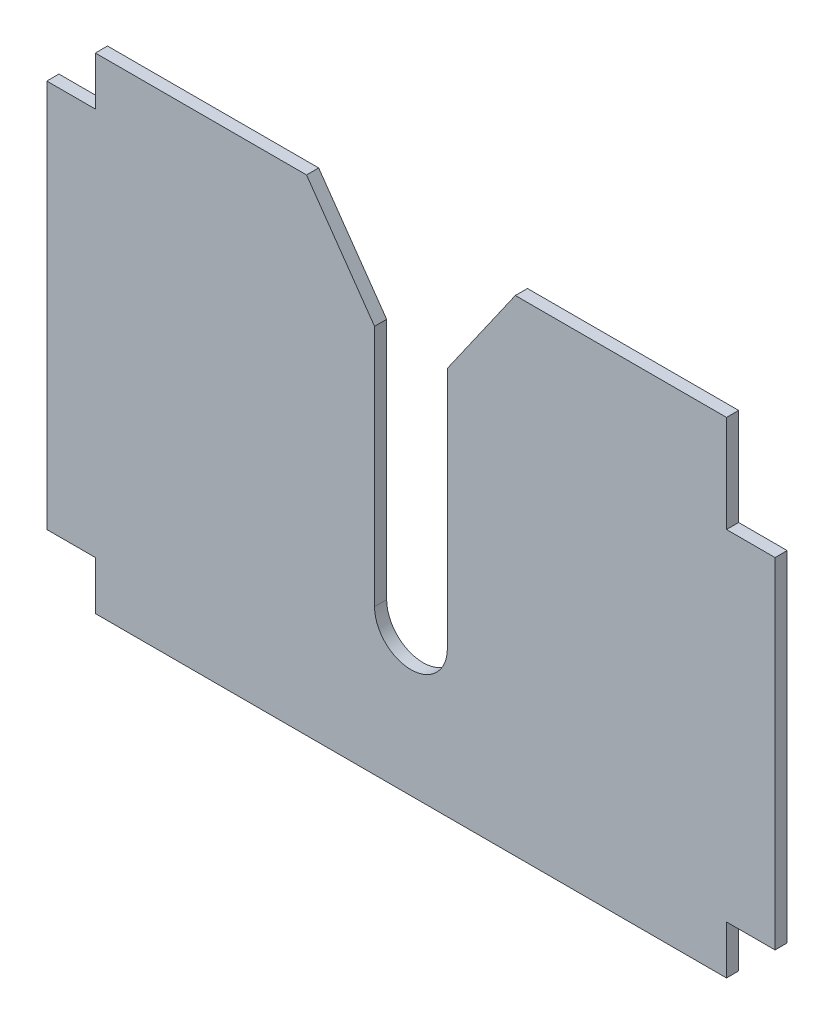
ISO-10303-21;
HEADER;
FILE_DESCRIPTION(('STEP AP214'),'2;1');
FILE_NAME('part.step','',(''),(''),'','','');
FILE_SCHEMA(('AUTOMOTIVE_DESIGN { 1 0 10303 214 1 1 1 1 }'));
ENDSEC;
DATA;
#1=APPLICATION_CONTEXT('core data for automotive mechanical design processes');
#2=APPLICATION_PROTOCOL_DEFINITION('international standard','automotive_design',2000,#1);
#3=PRODUCT_CONTEXT('',#1,'mechanical');
#4=PRODUCT('Part','Part','',(#3));
#5=PRODUCT_RELATED_PRODUCT_CATEGORY('part','',(#4));
#6=PRODUCT_DEFINITION_FORMATION('','',#4);
#7=PRODUCT_DEFINITION_CONTEXT('part definition',#1,'design');
#8=PRODUCT_DEFINITION('design','',#6,#7);
#9=PRODUCT_DEFINITION_SHAPE('','',#8);
#10=(LENGTH_UNIT() NAMED_UNIT(*) SI_UNIT(.MILLI.,.METRE.));
#11=(NAMED_UNIT(*) PLANE_ANGLE_UNIT() SI_UNIT($,.RADIAN.));
#12=(NAMED_UNIT(*) SI_UNIT($,.STERADIAN.) SOLID_ANGLE_UNIT());
#13=UNCERTAINTY_MEASURE_WITH_UNIT(LENGTH_MEASURE(1.E-05),#10,'distance_accuracy_value','');
#14=(GEOMETRIC_REPRESENTATION_CONTEXT(3) GLOBAL_UNCERTAINTY_ASSIGNED_CONTEXT((#13)) GLOBAL_UNIT_ASSIGNED_CONTEXT((#10,
#11,#12)) REPRESENTATION_CONTEXT('',''));
#15=CARTESIAN_POINT('',(0.,0.,0.));
#16=DIRECTION('',(0.,0.,1.));
#17=DIRECTION('',(1.,0.,0.));
#18=AXIS2_PLACEMENT_3D('',#15,#16,#17);
#19=CARTESIAN_POINT('',(-150.,100.,5.));
#20=DIRECTION('',(0.,-1.,0.));
#21=DIRECTION('',(0.,0.,-1.));
#22=AXIS2_PLACEMENT_3D('',#19,#20,#21);
#23=PLANE('',#22);
#24=DIRECTION('',(-1.,0.,0.));
#25=VECTOR('',#24,1.);
#26=CARTESIAN_POINT('',(-150.,100.,5.));
#27=LINE('',#26,#25);
#28=CARTESIAN_POINT('',(-43.0083015283883,100.,5.));
#29=VERTEX_POINT('',#28);
#30=CARTESIAN_POINT('',(-130.,100.,5.));
#31=VERTEX_POINT('',#30);
#32=EDGE_CURVE('E275',#29,#31,#27,.T.);
#33=ORIENTED_EDGE('',*,*,#32,.F.);
#34=DIRECTION('',(0.,0.,1.));
#35=VECTOR('',#34,1.);
#36=CARTESIAN_POINT('',(-43.0083015283883,100.,-5.));
#37=LINE('',#36,#35);
#38=CARTESIAN_POINT('',(-43.0083015283883,100.,0.));
#39=VERTEX_POINT('',#38);
#40=EDGE_CURVE('E210',#39,#29,#37,.T.);
#41=ORIENTED_EDGE('',*,*,#40,.F.);
#42=DIRECTION('',(-1.,0.,0.));
#43=VECTOR('',#42,1.);
#44=CARTESIAN_POINT('',(-150.,100.,0.));
#45=LINE('',#44,#43);
#46=CARTESIAN_POINT('',(-130.,100.,0.));
#47=VERTEX_POINT('',#46);
#48=EDGE_CURVE('E286',#39,#47,#45,.T.);
#49=ORIENTED_EDGE('',*,*,#48,.T.);
#50=DIRECTION('',(0.,0.,1.));
#51=VECTOR('',#50,1.);
#52=CARTESIAN_POINT('',(-130.,100.,0.));
#53=LINE('',#52,#51);
#54=EDGE_CURVE('E217',#47,#31,#53,.T.);
#55=ORIENTED_EDGE('',*,*,#54,.T.);
#56=EDGE_LOOP('',(#33,#41,#49,#55));
#57=FACE_BOUND('',#56,.T.);
#58=ADVANCED_FACE('F37',(#57),#23,.F.);
#59=CARTESIAN_POINT('',(150.,100.,5.));
#60=DIRECTION('',(-1.,0.,0.));
#61=DIRECTION('',(0.,-1.,0.));
#62=AXIS2_PLACEMENT_3D('',#59,#60,#61);
#63=PLANE('',#62);
#64=DIRECTION('',(0.,1.,0.));
#65=VECTOR('',#64,1.);
#66=CARTESIAN_POINT('',(150.,100.,5.));
#67=LINE('',#66,#65);
#68=CARTESIAN_POINT('',(150.,-80.,5.));
#69=VERTEX_POINT('',#68);
#70=CARTESIAN_POINT('',(150.,60.,5.));
#71=VERTEX_POINT('',#70);
#72=EDGE_CURVE('E272',#69,#71,#67,.T.);
#73=ORIENTED_EDGE('',*,*,#72,.F.);
#74=DIRECTION('',(0.,0.,1.));
#75=VECTOR('',#74,1.);
#76=CARTESIAN_POINT('',(150.,-80.,0.));
#77=LINE('',#76,#75);
#78=CARTESIAN_POINT('',(150.,-80.,0.));
#79=VERTEX_POINT('',#78);
#80=EDGE_CURVE('E249',#79,#69,#77,.T.);
#81=ORIENTED_EDGE('',*,*,#80,.F.);
#82=DIRECTION('',(0.,1.,0.));
#83=VECTOR('',#82,1.);
#84=CARTESIAN_POINT('',(150.,100.,0.));
#85=LINE('',#84,#83);
#86=CARTESIAN_POINT('',(150.,60.,0.));
#87=VERTEX_POINT('',#86);
#88=EDGE_CURVE('E268',#79,#87,#85,.T.);
#89=ORIENTED_EDGE('',*,*,#88,.T.);
#90=DIRECTION('',(0.,0.,1.));
#91=VECTOR('',#90,1.);
#92=CARTESIAN_POINT('',(150.,60.,0.));
#93=LINE('',#92,#91);
#94=EDGE_CURVE('E220',#87,#71,#93,.T.);
#95=ORIENTED_EDGE('',*,*,#94,.T.);
#96=EDGE_LOOP('',(#73,#81,#89,#95));
#97=FACE_BOUND('',#96,.T.);
#98=ADVANCED_FACE('F39',(#97),#63,.F.);
#99=CARTESIAN_POINT('',(130.,100.,0.));
#100=VERTEX_POINT('',#99);
#101=CARTESIAN_POINT('',(43.0083015283883,100.,0.));
#102=VERTEX_POINT('',#101);
#103=EDGE_CURVE('E171',#100,#102,#45,.T.);
#104=ORIENTED_EDGE('',*,*,#103,.T.);
#105=DIRECTION('',(0.,0.,1.));
#106=VECTOR('',#105,1.);
#107=CARTESIAN_POINT('',(43.0083015283883,100.,-5.));
#108=LINE('',#107,#106);
#109=CARTESIAN_POINT('',(43.0083015283883,100.,5.));
#110=VERTEX_POINT('',#109);
#111=EDGE_CURVE('E212',#102,#110,#108,.T.);
#112=ORIENTED_EDGE('',*,*,#111,.T.);
#113=CARTESIAN_POINT('',(130.,100.,5.));
#114=VERTEX_POINT('',#113);
#115=EDGE_CURVE('E276',#114,#110,#27,.T.);
#116=ORIENTED_EDGE('',*,*,#115,.F.);
#117=DIRECTION('',(0.,0.,1.));
#118=VECTOR('',#117,1.);
#119=CARTESIAN_POINT('',(130.,100.,0.));
#120=LINE('',#119,#118);
#121=EDGE_CURVE('E231',#100,#114,#120,.T.);
#122=ORIENTED_EDGE('',*,*,#121,.F.);
#123=EDGE_LOOP('',(#104,#112,#116,#122));
#124=FACE_BOUND('',#123,.T.);
#125=ADVANCED_FACE('F330',(#124),#23,.F.);
#126=CARTESIAN_POINT('',(-150.,100.,5.));
#127=DIRECTION('',(1.,0.,0.));
#128=DIRECTION('',(0.,1.,0.));
#129=AXIS2_PLACEMENT_3D('',#126,#127,#128);
#130=PLANE('',#129);
#131=DIRECTION('',(0.,-1.,0.));
#132=VECTOR('',#131,1.);
#133=CARTESIAN_POINT('',(-150.,100.,5.));
#134=LINE('',#133,#132);
#135=CARTESIAN_POINT('',(-150.,80.,5.));
#136=VERTEX_POINT('',#135);
#137=CARTESIAN_POINT('',(-150.,-80.,5.));
#138=VERTEX_POINT('',#137);
#139=EDGE_CURVE('E177',#136,#138,#134,.T.);
#140=ORIENTED_EDGE('',*,*,#139,.F.);
#141=DIRECTION('',(0.,0.,1.));
#142=VECTOR('',#141,1.);
#143=CARTESIAN_POINT('',(-150.,80.,0.));
#144=LINE('',#143,#142);
#145=CARTESIAN_POINT('',(-150.,80.,0.));
#146=VERTEX_POINT('',#145);
#147=EDGE_CURVE('E174',#146,#136,#144,.T.);
#148=ORIENTED_EDGE('',*,*,#147,.F.);
#149=DIRECTION('',(0.,-1.,0.));
#150=VECTOR('',#149,1.);
#151=CARTESIAN_POINT('',(-150.,100.,0.));
#152=LINE('',#151,#150);
#153=CARTESIAN_POINT('',(-150.,-80.,0.));
#154=VERTEX_POINT('',#153);
#155=EDGE_CURVE('E161',#146,#154,#152,.T.);
#156=ORIENTED_EDGE('',*,*,#155,.T.);
#157=DIRECTION('',(0.,0.,1.));
#158=VECTOR('',#157,1.);
#159=CARTESIAN_POINT('',(-150.,-80.,0.));
#160=LINE('',#159,#158);
#161=EDGE_CURVE('E266',#154,#138,#160,.T.);
#162=ORIENTED_EDGE('',*,*,#161,.T.);
#163=EDGE_LOOP('',(#140,#148,#156,#162));
#164=FACE_BOUND('',#163,.T.);
#165=ADVANCED_FACE('F175',(#164),#130,.F.);
#166=CARTESIAN_POINT('',(-150.,-100.,5.));
#167=DIRECTION('',(0.,1.,0.));
#168=DIRECTION('',(0.,0.,1.));
#169=AXIS2_PLACEMENT_3D('',#166,#167,#168);
#170=PLANE('',#169);
#171=DIRECTION('',(1.,0.,0.));
#172=VECTOR('',#171,1.);
#173=CARTESIAN_POINT('',(-150.,-100.,0.));
#174=LINE('',#173,#172);
#175=CARTESIAN_POINT('',(-130.,-100.,0.));
#176=VERTEX_POINT('',#175);
#177=CARTESIAN_POINT('',(130.,-100.,0.));
#178=VERTEX_POINT('',#177);
#179=EDGE_CURVE('E170',#176,#178,#174,.T.);
#180=ORIENTED_EDGE('',*,*,#179,.T.);
#181=DIRECTION('',(0.,0.,1.));
#182=VECTOR('',#181,1.);
#183=CARTESIAN_POINT('',(130.,-100.,0.));
#184=LINE('',#183,#182);
#185=CARTESIAN_POINT('',(130.,-100.,5.));
#186=VERTEX_POINT('',#185);
#187=EDGE_CURVE('E235',#178,#186,#184,.T.);
#188=ORIENTED_EDGE('',*,*,#187,.T.);
#189=DIRECTION('',(1.,0.,0.));
#190=VECTOR('',#189,1.);
#191=CARTESIAN_POINT('',(-150.,-100.,5.));
#192=LINE('',#191,#190);
#193=CARTESIAN_POINT('',(-130.,-100.,5.));
#194=VERTEX_POINT('',#193);
#195=EDGE_CURVE('E280',#194,#186,#192,.T.);
#196=ORIENTED_EDGE('',*,*,#195,.F.);
#197=DIRECTION('',(0.,0.,1.));
#198=VECTOR('',#197,1.);
#199=CARTESIAN_POINT('',(-130.,-100.,0.));
#200=LINE('',#199,#198);
#201=EDGE_CURVE('E262',#176,#194,#200,.T.);
#202=ORIENTED_EDGE('',*,*,#201,.F.);
#203=EDGE_LOOP('',(#180,#188,#196,#202));
#204=FACE_BOUND('',#203,.T.);
#205=ADVANCED_FACE('F352',(#204),#170,.F.);
#206=CARTESIAN_POINT('',(0.,0.,5.));
#207=DIRECTION('',(0.,0.,1.));
#208=DIRECTION('',(1.,0.,0.));
#209=AXIS2_PLACEMENT_3D('',#206,#207,#208);
#210=PLANE('',#209);
#211=DIRECTION('',(0.,1.,0.));
#212=VECTOR('',#211,1.);
#213=CARTESIAN_POINT('',(-130.,100.,5.));
#214=LINE('',#213,#212);
#215=CARTESIAN_POINT('',(-130.,80.,5.));
#216=VERTEX_POINT('',#215);
#217=EDGE_CURVE('E218',#216,#31,#214,.T.);
#218=ORIENTED_EDGE('',*,*,#217,.F.);
#219=DIRECTION('',(-1.,0.,0.));
#220=VECTOR('',#219,1.);
#221=CARTESIAN_POINT('',(-130.,80.,5.));
#222=LINE('',#221,#220);
#223=EDGE_CURVE('E184',#216,#136,#222,.T.);
#224=ORIENTED_EDGE('',*,*,#223,.T.);
#225=ORIENTED_EDGE('',*,*,#139,.T.);
#226=DIRECTION('',(-1.,0.,0.));
#227=VECTOR('',#226,1.);
#228=CARTESIAN_POINT('',(-150.,-80.,5.));
#229=LINE('',#228,#227);
#230=CARTESIAN_POINT('',(-130.,-80.,5.));
#231=VERTEX_POINT('',#230);
#232=EDGE_CURVE('E260',#231,#138,#229,.T.);
#233=ORIENTED_EDGE('',*,*,#232,.F.);
#234=DIRECTION('',(0.,1.,0.));
#235=VECTOR('',#234,1.);
#236=CARTESIAN_POINT('',(-130.,-100.,5.));
#237=LINE('',#236,#235);
#238=EDGE_CURVE('E223',#194,#231,#237,.T.);
#239=ORIENTED_EDGE('',*,*,#238,.F.);
#240=ORIENTED_EDGE('',*,*,#195,.T.);
#241=DIRECTION('',(0.,-1.,0.));
#242=VECTOR('',#241,1.);
#243=CARTESIAN_POINT('',(130.,-100.,5.));
#244=LINE('',#243,#242);
#245=CARTESIAN_POINT('',(130.,-80.,5.));
#246=VERTEX_POINT('',#245);
#247=EDGE_CURVE('E246',#246,#186,#244,.T.);
#248=ORIENTED_EDGE('',*,*,#247,.F.);
#249=DIRECTION('',(-1.,0.,0.));
#250=VECTOR('',#249,1.);
#251=CARTESIAN_POINT('',(150.,-80.,5.));
#252=LINE('',#251,#250);
#253=EDGE_CURVE('E205',#69,#246,#252,.T.);
#254=ORIENTED_EDGE('',*,*,#253,.F.);
#255=ORIENTED_EDGE('',*,*,#72,.T.);
#256=DIRECTION('',(1.,0.,0.));
#257=VECTOR('',#256,1.);
#258=CARTESIAN_POINT('',(150.,60.,5.));
#259=LINE('',#258,#257);
#260=CARTESIAN_POINT('',(130.,60.,5.));
#261=VERTEX_POINT('',#260);
#262=EDGE_CURVE('E228',#261,#71,#259,.T.);
#263=ORIENTED_EDGE('',*,*,#262,.F.);
#264=DIRECTION('',(0.,-1.,0.));
#265=VECTOR('',#264,1.);
#266=CARTESIAN_POINT('',(130.,100.,5.));
#267=LINE('',#266,#265);
#268=EDGE_CURVE('E232',#114,#261,#267,.T.);
#269=ORIENTED_EDGE('',*,*,#268,.F.);
#270=ORIENTED_EDGE('',*,*,#115,.T.);
#271=DIRECTION('',(0.573576436351045,0.819152044288993,0.));
#272=VECTOR('',#271,1.);
#273=CARTESIAN_POINT('',(15.,60.,5.));
#274=LINE('',#273,#272);
#275=CARTESIAN_POINT('',(15.,60.,5.));
#276=VERTEX_POINT('',#275);
#277=EDGE_CURVE('E191',#276,#110,#274,.T.);
#278=ORIENTED_EDGE('',*,*,#277,.F.);
#279=DIRECTION('',(0.,1.,0.));
#280=VECTOR('',#279,1.);
#281=CARTESIAN_POINT('',(15.,-40.,5.));
#282=LINE('',#281,#280);
#283=CARTESIAN_POINT('',(15.,-40.,5.));
#284=VERTEX_POINT('',#283);
#285=EDGE_CURVE('E181',#284,#276,#282,.T.);
#286=ORIENTED_EDGE('',*,*,#285,.F.);
#287=CARTESIAN_POINT('',(0.,-40.,5.));
#288=DIRECTION('',(0.,0.,1.));
#289=DIRECTION('',(1.,0.,0.));
#290=AXIS2_PLACEMENT_3D('',#287,#288,#289);
#291=CIRCLE('',#290,15.);
#292=CARTESIAN_POINT('',(-15.,-40.,5.));
#293=VERTEX_POINT('',#292);
#294=EDGE_CURVE('E199',#293,#284,#291,.T.);
#295=ORIENTED_EDGE('',*,*,#294,.F.);
#296=DIRECTION('',(0.,1.,0.));
#297=VECTOR('',#296,1.);
#298=CARTESIAN_POINT('',(-15.,-40.,5.));
#299=LINE('',#298,#297);
#300=CARTESIAN_POINT('',(-15.,60.,5.));
#301=VERTEX_POINT('',#300);
#302=EDGE_CURVE('E196',#293,#301,#299,.T.);
#303=ORIENTED_EDGE('',*,*,#302,.T.);
#304=DIRECTION('',(0.573576436351045,-0.819152044288993,0.));
#305=VECTOR('',#304,1.);
#306=CARTESIAN_POINT('',(-43.0083015283883,100.,5.));
#307=LINE('',#306,#305);
#308=EDGE_CURVE('E193',#29,#301,#307,.T.);
#309=ORIENTED_EDGE('',*,*,#308,.F.);
#310=ORIENTED_EDGE('',*,*,#32,.T.);
#311=EDGE_LOOP('',(#218,#224,#225,#233,#239,#240,#248,#254,#255,#263,#269,#270,#278,#286,#295,
#303,#309,#310));
#312=FACE_BOUND('',#311,.T.);
#313=ADVANCED_FACE('F315',(#312),#210,.T.);
#314=CARTESIAN_POINT('',(0.,0.,0.));
#315=DIRECTION('',(0.,0.,1.));
#316=DIRECTION('',(1.,0.,0.));
#317=AXIS2_PLACEMENT_3D('',#314,#315,#316);
#318=PLANE('',#317);
#319=DIRECTION('',(-1.,0.,0.));
#320=VECTOR('',#319,1.);
#321=CARTESIAN_POINT('',(-130.,80.,0.));
#322=LINE('',#321,#320);
#323=CARTESIAN_POINT('',(-130.,80.,0.));
#324=VERTEX_POINT('',#323);
#325=EDGE_CURVE('E165',#324,#146,#322,.T.);
#326=ORIENTED_EDGE('',*,*,#325,.F.);
#327=DIRECTION('',(0.,1.,0.));
#328=VECTOR('',#327,1.);
#329=CARTESIAN_POINT('',(-130.,100.,0.));
#330=LINE('',#329,#328);
#331=EDGE_CURVE('E52',#324,#47,#330,.T.);
#332=ORIENTED_EDGE('',*,*,#331,.T.);
#333=ORIENTED_EDGE('',*,*,#48,.F.);
#334=DIRECTION('',(0.573576436351045,-0.819152044288993,0.));
#335=VECTOR('',#334,1.);
#336=CARTESIAN_POINT('',(18.1256275486347,12.6917010443356,0.));
#337=LINE('',#336,#335);
#338=CARTESIAN_POINT('',(-15.,60.,0.));
#339=VERTEX_POINT('',#338);
#340=EDGE_CURVE('E11',#39,#339,#337,.T.);
#341=ORIENTED_EDGE('',*,*,#340,.T.);
#342=DIRECTION('',(0.,1.,0.));
#343=VECTOR('',#342,1.);
#344=CARTESIAN_POINT('',(-15.,0.,0.));
#345=LINE('',#344,#343);
#346=CARTESIAN_POINT('',(-15.,-40.,0.));
#347=VERTEX_POINT('',#346);
#348=EDGE_CURVE('E45',#347,#339,#345,.T.);
#349=ORIENTED_EDGE('',*,*,#348,.F.);
#350=CARTESIAN_POINT('',(0.,-40.,0.));
#351=DIRECTION('',(0.,0.,1.));
#352=DIRECTION('',(1.,0.,0.));
#353=AXIS2_PLACEMENT_3D('',#350,#351,#352);
#354=CIRCLE('',#353,15.);
#355=CARTESIAN_POINT('',(15.,-40.,0.));
#356=VERTEX_POINT('',#355);
#357=EDGE_CURVE('E296',#347,#356,#354,.T.);
#358=ORIENTED_EDGE('',*,*,#357,.T.);
#359=DIRECTION('',(0.,1.,0.));
#360=VECTOR('',#359,1.);
#361=CARTESIAN_POINT('',(15.,0.,0.));
#362=LINE('',#361,#360);
#363=CARTESIAN_POINT('',(15.,60.,0.));
#364=VERTEX_POINT('',#363);
#365=EDGE_CURVE('E293',#356,#364,#362,.T.);
#366=ORIENTED_EDGE('',*,*,#365,.T.);
#367=DIRECTION('',(0.573576436351045,0.819152044288993,0.));
#368=VECTOR('',#367,1.);
#369=CARTESIAN_POINT('',(-18.1256275486347,12.6917010443356,0.));
#370=LINE('',#369,#368);
#371=EDGE_CURVE('E283',#364,#102,#370,.T.);
#372=ORIENTED_EDGE('',*,*,#371,.T.);
#373=ORIENTED_EDGE('',*,*,#103,.F.);
#374=DIRECTION('',(0.,-1.,0.));
#375=VECTOR('',#374,1.);
#376=CARTESIAN_POINT('',(130.,100.,0.));
#377=LINE('',#376,#375);
#378=CARTESIAN_POINT('',(130.,60.,0.));
#379=VERTEX_POINT('',#378);
#380=EDGE_CURVE('E224',#100,#379,#377,.T.);
#381=ORIENTED_EDGE('',*,*,#380,.T.);
#382=DIRECTION('',(1.,0.,0.));
#383=VECTOR('',#382,1.);
#384=CARTESIAN_POINT('',(150.,60.,0.));
#385=LINE('',#384,#383);
#386=EDGE_CURVE('E227',#379,#87,#385,.T.);
#387=ORIENTED_EDGE('',*,*,#386,.T.);
#388=ORIENTED_EDGE('',*,*,#88,.F.);
#389=DIRECTION('',(-1.,0.,0.));
#390=VECTOR('',#389,1.);
#391=CARTESIAN_POINT('',(150.,-80.,0.));
#392=LINE('',#391,#390);
#393=CARTESIAN_POINT('',(130.,-80.,0.));
#394=VERTEX_POINT('',#393);
#395=EDGE_CURVE('E242',#79,#394,#392,.T.);
#396=ORIENTED_EDGE('',*,*,#395,.T.);
#397=DIRECTION('',(0.,-1.,0.));
#398=VECTOR('',#397,1.);
#399=CARTESIAN_POINT('',(130.,-100.,0.));
#400=LINE('',#399,#398);
#401=EDGE_CURVE('E245',#394,#178,#400,.T.);
#402=ORIENTED_EDGE('',*,*,#401,.T.);
#403=ORIENTED_EDGE('',*,*,#179,.F.);
#404=DIRECTION('',(0.,1.,0.));
#405=VECTOR('',#404,1.);
#406=CARTESIAN_POINT('',(-130.,-100.,0.));
#407=LINE('',#406,#405);
#408=CARTESIAN_POINT('',(-130.,-80.,0.));
#409=VERTEX_POINT('',#408);
#410=EDGE_CURVE('E258',#176,#409,#407,.T.);
#411=ORIENTED_EDGE('',*,*,#410,.T.);
#412=DIRECTION('',(-1.,0.,0.));
#413=VECTOR('',#412,1.);
#414=CARTESIAN_POINT('',(-150.,-80.,0.));
#415=LINE('',#414,#413);
#416=EDGE_CURVE('E167',#409,#154,#415,.T.);
#417=ORIENTED_EDGE('',*,*,#416,.T.);
#418=ORIENTED_EDGE('',*,*,#155,.F.);
#419=EDGE_LOOP('',(#326,#332,#333,#341,#349,#358,#366,#372,#373,#381,#387,#388,#396,#402,#403,
#411,#417,#418));
#420=FACE_BOUND('',#419,.T.);
#421=ADVANCED_FACE('F163',(#420),#318,.F.);
#422=CARTESIAN_POINT('',(-150.,-80.,0.));
#423=DIRECTION('',(0.,1.,0.));
#424=DIRECTION('',(0.,0.,1.));
#425=AXIS2_PLACEMENT_3D('',#422,#423,#424);
#426=PLANE('',#425);
#427=ORIENTED_EDGE('',*,*,#232,.T.);
#428=ORIENTED_EDGE('',*,*,#161,.F.);
#429=ORIENTED_EDGE('',*,*,#416,.F.);
#430=DIRECTION('',(0.,0.,1.));
#431=VECTOR('',#430,1.);
#432=CARTESIAN_POINT('',(-130.,-80.,0.));
#433=LINE('',#432,#431);
#434=EDGE_CURVE('E269',#409,#231,#433,.T.);
#435=ORIENTED_EDGE('',*,*,#434,.T.);
#436=EDGE_LOOP('',(#427,#428,#429,#435));
#437=FACE_BOUND('',#436,.T.);
#438=ADVANCED_FACE('F360',(#437),#426,.F.);
#439=CARTESIAN_POINT('',(-130.,-100.,0.));
#440=DIRECTION('',(1.,0.,0.));
#441=DIRECTION('',(0.,0.,-1.));
#442=AXIS2_PLACEMENT_3D('',#439,#440,#441);
#443=PLANE('',#442);
#444=ORIENTED_EDGE('',*,*,#238,.T.);
#445=ORIENTED_EDGE('',*,*,#434,.F.);
#446=ORIENTED_EDGE('',*,*,#410,.F.);
#447=ORIENTED_EDGE('',*,*,#201,.T.);
#448=EDGE_LOOP('',(#444,#445,#446,#447));
#449=FACE_BOUND('',#448,.T.);
#450=ADVANCED_FACE('F357',(#449),#443,.F.);
#451=CARTESIAN_POINT('',(-130.,100.,0.));
#452=DIRECTION('',(1.,0.,0.));
#453=DIRECTION('',(0.,0.,-1.));
#454=AXIS2_PLACEMENT_3D('',#451,#452,#453);
#455=PLANE('',#454);
#456=ORIENTED_EDGE('',*,*,#331,.F.);
#457=DIRECTION('',(0.,0.,1.));
#458=VECTOR('',#457,1.);
#459=CARTESIAN_POINT('',(-130.,80.,0.));
#460=LINE('',#459,#458);
#461=EDGE_CURVE('E56',#324,#216,#460,.T.);
#462=ORIENTED_EDGE('',*,*,#461,.T.);
#463=ORIENTED_EDGE('',*,*,#217,.T.);
#464=ORIENTED_EDGE('',*,*,#54,.F.);
#465=EDGE_LOOP('',(#456,#462,#463,#464));
#466=FACE_BOUND('',#465,.T.);
#467=ADVANCED_FACE('F312',(#466),#455,.F.);
#468=CARTESIAN_POINT('',(150.,60.,0.));
#469=DIRECTION('',(0.,-1.,0.));
#470=DIRECTION('',(0.,0.,-1.));
#471=AXIS2_PLACEMENT_3D('',#468,#469,#470);
#472=PLANE('',#471);
#473=ORIENTED_EDGE('',*,*,#262,.T.);
#474=ORIENTED_EDGE('',*,*,#94,.F.);
#475=ORIENTED_EDGE('',*,*,#386,.F.);
#476=DIRECTION('',(0.,0.,1.));
#477=VECTOR('',#476,1.);
#478=CARTESIAN_POINT('',(130.,60.,0.));
#479=LINE('',#478,#477);
#480=EDGE_CURVE('E239',#379,#261,#479,.T.);
#481=ORIENTED_EDGE('',*,*,#480,.T.);
#482=EDGE_LOOP('',(#473,#474,#475,#481));
#483=FACE_BOUND('',#482,.T.);
#484=ADVANCED_FACE('F405',(#483),#472,.F.);
#485=CARTESIAN_POINT('',(130.,100.,0.));
#486=DIRECTION('',(-1.,0.,0.));
#487=DIRECTION('',(0.,0.,1.));
#488=AXIS2_PLACEMENT_3D('',#485,#486,#487);
#489=PLANE('',#488);
#490=ORIENTED_EDGE('',*,*,#268,.T.);
#491=ORIENTED_EDGE('',*,*,#480,.F.);
#492=ORIENTED_EDGE('',*,*,#380,.F.);
#493=ORIENTED_EDGE('',*,*,#121,.T.);
#494=EDGE_LOOP('',(#490,#491,#492,#493));
#495=FACE_BOUND('',#494,.T.);
#496=ADVANCED_FACE('F336',(#495),#489,.F.);
#497=CARTESIAN_POINT('',(130.,-100.,0.));
#498=DIRECTION('',(-1.,0.,0.));
#499=DIRECTION('',(0.,0.,1.));
#500=AXIS2_PLACEMENT_3D('',#497,#498,#499);
#501=PLANE('',#500);
#502=ORIENTED_EDGE('',*,*,#247,.T.);
#503=ORIENTED_EDGE('',*,*,#187,.F.);
#504=ORIENTED_EDGE('',*,*,#401,.F.);
#505=DIRECTION('',(0.,0.,1.));
#506=VECTOR('',#505,1.);
#507=CARTESIAN_POINT('',(130.,-80.,0.));
#508=LINE('',#507,#506);
#509=EDGE_CURVE('E255',#394,#246,#508,.T.);
#510=ORIENTED_EDGE('',*,*,#509,.T.);
#511=EDGE_LOOP('',(#502,#503,#504,#510));
#512=FACE_BOUND('',#511,.T.);
#513=ADVANCED_FACE('F350',(#512),#501,.F.);
#514=CARTESIAN_POINT('',(150.,-80.,0.));
#515=DIRECTION('',(0.,1.,0.));
#516=DIRECTION('',(0.,0.,1.));
#517=AXIS2_PLACEMENT_3D('',#514,#515,#516);
#518=PLANE('',#517);
#519=ORIENTED_EDGE('',*,*,#253,.T.);
#520=ORIENTED_EDGE('',*,*,#509,.F.);
#521=ORIENTED_EDGE('',*,*,#395,.F.);
#522=ORIENTED_EDGE('',*,*,#80,.T.);
#523=EDGE_LOOP('',(#519,#520,#521,#522));
#524=FACE_BOUND('',#523,.T.);
#525=ADVANCED_FACE('F344',(#524),#518,.F.);
#526=CARTESIAN_POINT('',(15.,-40.,-5.));
#527=DIRECTION('',(1.,0.,0.));
#528=DIRECTION('',(0.,0.,-1.));
#529=AXIS2_PLACEMENT_3D('',#526,#527,#528);
#530=PLANE('',#529);
#531=DIRECTION('',(0.,0.,1.));
#532=VECTOR('',#531,1.);
#533=CARTESIAN_POINT('',(15.,-40.,-5.));
#534=LINE('',#533,#532);
#535=EDGE_CURVE('E203',#356,#284,#534,.T.);
#536=ORIENTED_EDGE('',*,*,#535,.T.);
#537=ORIENTED_EDGE('',*,*,#285,.T.);
#538=DIRECTION('',(0.,0.,1.));
#539=VECTOR('',#538,1.);
#540=CARTESIAN_POINT('',(15.,60.,-5.));
#541=LINE('',#540,#539);
#542=EDGE_CURVE('E202',#364,#276,#541,.T.);
#543=ORIENTED_EDGE('',*,*,#542,.F.);
#544=ORIENTED_EDGE('',*,*,#365,.F.);
#545=EDGE_LOOP('',(#536,#537,#543,#544));
#546=FACE_BOUND('',#545,.T.);
#547=ADVANCED_FACE('F325',(#546),#530,.F.);
#548=CARTESIAN_POINT('',(0.,-40.,-5.));
#549=DIRECTION('',(0.,0.,1.));
#550=DIRECTION('',(1.,0.,0.));
#551=AXIS2_PLACEMENT_3D('',#548,#549,#550);
#552=CYLINDRICAL_SURFACE('',#551,15.);
#553=DIRECTION('',(0.,0.,1.));
#554=VECTOR('',#553,1.);
#555=CARTESIAN_POINT('',(-15.,-40.,-5.));
#556=LINE('',#555,#554);
#557=EDGE_CURVE('E206',#347,#293,#556,.T.);
#558=ORIENTED_EDGE('',*,*,#557,.T.);
#559=ORIENTED_EDGE('',*,*,#294,.T.);
#560=ORIENTED_EDGE('',*,*,#535,.F.);
#561=ORIENTED_EDGE('',*,*,#357,.F.);
#562=EDGE_LOOP('',(#558,#559,#560,#561));
#563=FACE_BOUND('',#562,.T.);
#564=ADVANCED_FACE('F321',(#563),#552,.F.);
#565=CARTESIAN_POINT('',(-15.,-40.,-5.));
#566=DIRECTION('',(1.,0.,0.));
#567=DIRECTION('',(0.,0.,-1.));
#568=AXIS2_PLACEMENT_3D('',#565,#566,#567);
#569=PLANE('',#568);
#570=ORIENTED_EDGE('',*,*,#348,.T.);
#571=DIRECTION('',(0.,0.,1.));
#572=VECTOR('',#571,1.);
#573=CARTESIAN_POINT('',(-15.,60.,-5.));
#574=LINE('',#573,#572);
#575=EDGE_CURVE('E208',#339,#301,#574,.T.);
#576=ORIENTED_EDGE('',*,*,#575,.T.);
#577=ORIENTED_EDGE('',*,*,#302,.F.);
#578=ORIENTED_EDGE('',*,*,#557,.F.);
#579=EDGE_LOOP('',(#570,#576,#577,#578));
#580=FACE_BOUND('',#579,.T.);
#581=ADVANCED_FACE('F302',(#580),#569,.T.);
#582=CARTESIAN_POINT('',(-43.0083015283883,100.,-5.));
#583=DIRECTION('',(-0.819152044288993,-0.573576436351045,0.));
#584=DIRECTION('',(0.573576436351045,-0.819152044288993,0.));
#585=AXIS2_PLACEMENT_3D('',#582,#583,#584);
#586=PLANE('',#585);
#587=ORIENTED_EDGE('',*,*,#40,.T.);
#588=ORIENTED_EDGE('',*,*,#308,.T.);
#589=ORIENTED_EDGE('',*,*,#575,.F.);
#590=ORIENTED_EDGE('',*,*,#340,.F.);
#591=EDGE_LOOP('',(#587,#588,#589,#590));
#592=FACE_BOUND('',#591,.T.);
#593=ADVANCED_FACE('F305',(#592),#586,.F.);
#594=CARTESIAN_POINT('',(15.,60.,-5.));
#595=DIRECTION('',(0.819152044288993,-0.573576436351045,0.));
#596=DIRECTION('',(0.573576436351045,0.819152044288993,0.));
#597=AXIS2_PLACEMENT_3D('',#594,#595,#596);
#598=PLANE('',#597);
#599=ORIENTED_EDGE('',*,*,#542,.T.);
#600=ORIENTED_EDGE('',*,*,#277,.T.);
#601=ORIENTED_EDGE('',*,*,#111,.F.);
#602=ORIENTED_EDGE('',*,*,#371,.F.);
#603=EDGE_LOOP('',(#599,#600,#601,#602));
#604=FACE_BOUND('',#603,.T.);
#605=ADVANCED_FACE('F327',(#604),#598,.F.);
#606=CARTESIAN_POINT('',(-130.,80.,0.));
#607=DIRECTION('',(0.,1.,0.));
#608=DIRECTION('',(0.,0.,1.));
#609=AXIS2_PLACEMENT_3D('',#606,#607,#608);
#610=PLANE('',#609);
#611=ORIENTED_EDGE('',*,*,#223,.F.);
#612=ORIENTED_EDGE('',*,*,#461,.F.);
#613=ORIENTED_EDGE('',*,*,#325,.T.);
#614=ORIENTED_EDGE('',*,*,#147,.T.);
#615=EDGE_LOOP('',(#611,#612,#613,#614));
#616=FACE_BOUND('',#615,.T.);
#617=ADVANCED_FACE('F183',(#616),#610,.T.);
#618=CLOSED_SHELL('',(#58,#98,#125,#165,#205,#313,#421,#438,#450,#467,#484,#496,#513,#525,#547,
#564,#581,#593,#605,#617));
#619=MANIFOLD_SOLID_BREP('B2',#618);
#620=ADVANCED_BREP_SHAPE_REPRESENTATION('',(#18,#619),#14);
#621=SHAPE_DEFINITION_REPRESENTATION(#9,#620);
ENDSEC;
END-ISO-10303-21;
